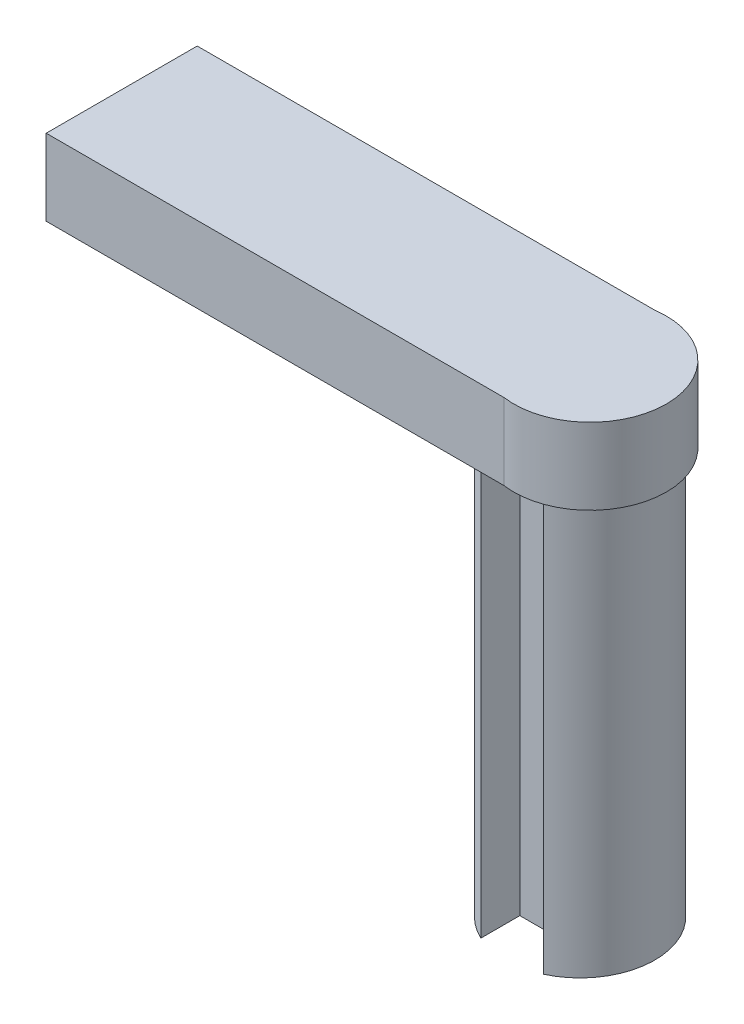
ISO-10303-21;
HEADER;
FILE_DESCRIPTION(('STEP AP214'),'2;1');
FILE_NAME('part.step','',(''),(''),'','','');
FILE_SCHEMA(('AUTOMOTIVE_DESIGN { 1 0 10303 214 1 1 1 1 }'));
ENDSEC;
DATA;
#1=APPLICATION_CONTEXT('core data for automotive mechanical design processes');
#2=APPLICATION_PROTOCOL_DEFINITION('international standard','automotive_design',2000,#1);
#3=PRODUCT_CONTEXT('',#1,'mechanical');
#4=PRODUCT('Part','Part','',(#3));
#5=PRODUCT_RELATED_PRODUCT_CATEGORY('part','',(#4));
#6=PRODUCT_DEFINITION_FORMATION('','',#4);
#7=PRODUCT_DEFINITION_CONTEXT('part definition',#1,'design');
#8=PRODUCT_DEFINITION('design','',#6,#7);
#9=PRODUCT_DEFINITION_SHAPE('','',#8);
#10=(LENGTH_UNIT() NAMED_UNIT(*) SI_UNIT(.MILLI.,.METRE.));
#11=(NAMED_UNIT(*) PLANE_ANGLE_UNIT() SI_UNIT($,.RADIAN.));
#12=(NAMED_UNIT(*) SI_UNIT($,.STERADIAN.) SOLID_ANGLE_UNIT());
#13=UNCERTAINTY_MEASURE_WITH_UNIT(LENGTH_MEASURE(1.E-05),#10,'distance_accuracy_value','');
#14=(GEOMETRIC_REPRESENTATION_CONTEXT(3) GLOBAL_UNCERTAINTY_ASSIGNED_CONTEXT((#13)) GLOBAL_UNIT_ASSIGNED_CONTEXT((#10,
#11,#12)) REPRESENTATION_CONTEXT('',''));
#15=CARTESIAN_POINT('',(0.,0.,0.));
#16=DIRECTION('',(0.,0.,1.));
#17=DIRECTION('',(1.,0.,0.));
#18=AXIS2_PLACEMENT_3D('',#15,#16,#17);
#19=CARTESIAN_POINT('',(0.,27.,0.));
#20=DIRECTION('',(0.,-1.,0.));
#21=DIRECTION('',(0.,0.,-1.));
#22=AXIS2_PLACEMENT_3D('',#19,#20,#21);
#23=CYLINDRICAL_SURFACE('',#22,4.9);
#24=CARTESIAN_POINT('',(0.,0.,0.));
#25=DIRECTION('',(0.,1.,0.));
#26=DIRECTION('',(0.,0.,1.));
#27=AXIS2_PLACEMENT_3D('',#24,#25,#26);
#28=CIRCLE('',#27,4.9);
#29=CARTESIAN_POINT('',(2.05,0.,4.45056176229474));
#30=VERTEX_POINT('',#29);
#31=CARTESIAN_POINT('',(-2.05,0.,4.45056176229473));
#32=VERTEX_POINT('',#31);
#33=EDGE_CURVE('E139',#30,#32,#28,.T.);
#34=ORIENTED_EDGE('',*,*,#33,.T.);
#35=DIRECTION('',(0.,1.,0.));
#36=VECTOR('',#35,1.);
#37=CARTESIAN_POINT('',(-2.05,-1.,4.45056176229473));
#38=LINE('',#37,#36);
#39=CARTESIAN_POINT('',(-2.05,27.,4.45056176229473));
#40=VERTEX_POINT('',#39);
#41=EDGE_CURVE('E137',#32,#40,#38,.T.);
#42=ORIENTED_EDGE('',*,*,#41,.T.);
#43=CARTESIAN_POINT('',(0.,27.,0.));
#44=DIRECTION('',(0.,1.,0.));
#45=DIRECTION('',(0.,0.,1.));
#46=AXIS2_PLACEMENT_3D('',#43,#44,#45);
#47=CIRCLE('',#46,4.9);
#48=CARTESIAN_POINT('',(0.,27.,-4.9));
#49=VERTEX_POINT('',#48);
#50=EDGE_CURVE('E47',#49,#40,#47,.T.);
#51=ORIENTED_EDGE('',*,*,#50,.F.);
#52=CARTESIAN_POINT('',(2.05,27.,4.45056176229474));
#53=VERTEX_POINT('',#52);
#54=EDGE_CURVE('E144',#53,#49,#47,.T.);
#55=ORIENTED_EDGE('',*,*,#54,.F.);
#56=DIRECTION('',(0.,1.,0.));
#57=VECTOR('',#56,1.);
#58=CARTESIAN_POINT('',(2.05,-1.,4.45056176229474));
#59=LINE('',#58,#57);
#60=EDGE_CURVE('E136',#30,#53,#59,.T.);
#61=ORIENTED_EDGE('',*,*,#60,.F.);
#62=EDGE_LOOP('',(#34,#42,#51,#55,#61));
#63=FACE_BOUND('',#62,.T.);
#64=ADVANCED_FACE('F33',(#63),#23,.T.);
#65=CARTESIAN_POINT('',(0.,0.,0.));
#66=DIRECTION('',(0.,1.,0.));
#67=DIRECTION('',(0.,0.,1.));
#68=AXIS2_PLACEMENT_3D('',#65,#66,#67);
#69=PLANE('',#68);
#70=DIRECTION('',(-1.,0.,0.));
#71=VECTOR('',#70,1.);
#72=CARTESIAN_POINT('',(0.,0.,1.90056176229474));
#73=LINE('',#72,#71);
#74=CARTESIAN_POINT('',(2.05,0.,1.90056176229474));
#75=VERTEX_POINT('',#74);
#76=CARTESIAN_POINT('',(-2.05,0.,1.90056176229474));
#77=VERTEX_POINT('',#76);
#78=EDGE_CURVE('E40',#75,#77,#73,.T.);
#79=ORIENTED_EDGE('',*,*,#78,.T.);
#80=DIRECTION('',(0.,0.,1.));
#81=VECTOR('',#80,1.);
#82=CARTESIAN_POINT('',(-2.05,0.,0.));
#83=LINE('',#82,#81);
#84=EDGE_CURVE('E11',#77,#32,#83,.T.);
#85=ORIENTED_EDGE('',*,*,#84,.T.);
#86=ORIENTED_EDGE('',*,*,#33,.F.);
#87=DIRECTION('',(0.,0.,-1.));
#88=VECTOR('',#87,1.);
#89=CARTESIAN_POINT('',(2.05,0.,0.));
#90=LINE('',#89,#88);
#91=EDGE_CURVE('E146',#30,#75,#90,.T.);
#92=ORIENTED_EDGE('',*,*,#91,.T.);
#93=EDGE_LOOP('',(#79,#85,#86,#92));
#94=FACE_BOUND('',#93,.T.);
#95=ADVANCED_FACE('F152',(#94),#69,.F.);
#96=CARTESIAN_POINT('',(-2.05,-1.,4.45056176229473));
#97=DIRECTION('',(-1.,0.,0.));
#98=DIRECTION('',(0.,0.,1.));
#99=AXIS2_PLACEMENT_3D('',#96,#97,#98);
#100=PLANE('',#99);
#101=DIRECTION('',(0.,1.,0.));
#102=VECTOR('',#101,1.);
#103=CARTESIAN_POINT('',(-2.05,-1.,1.90056176229474));
#104=LINE('',#103,#102);
#105=CARTESIAN_POINT('',(-2.05,27.,1.90056176229474));
#106=VERTEX_POINT('',#105);
#107=EDGE_CURVE('E140',#77,#106,#104,.T.);
#108=ORIENTED_EDGE('',*,*,#107,.T.);
#109=DIRECTION('',(0.,0.,1.));
#110=VECTOR('',#109,1.);
#111=CARTESIAN_POINT('',(-2.05,27.,4.45056176229473));
#112=LINE('',#111,#110);
#113=EDGE_CURVE('E133',#106,#40,#112,.T.);
#114=ORIENTED_EDGE('',*,*,#113,.T.);
#115=ORIENTED_EDGE('',*,*,#41,.F.);
#116=ORIENTED_EDGE('',*,*,#84,.F.);
#117=EDGE_LOOP('',(#108,#114,#115,#116));
#118=FACE_BOUND('',#117,.T.);
#119=ADVANCED_FACE('F160',(#118),#100,.F.);
#120=CARTESIAN_POINT('',(-2.05,-1.,1.90056176229474));
#121=DIRECTION('',(0.,0.,-1.));
#122=DIRECTION('',(-1.,0.,0.));
#123=AXIS2_PLACEMENT_3D('',#120,#121,#122);
#124=PLANE('',#123);
#125=DIRECTION('',(0.,1.,0.));
#126=VECTOR('',#125,1.);
#127=CARTESIAN_POINT('',(2.05,-1.,1.90056176229474));
#128=LINE('',#127,#126);
#129=CARTESIAN_POINT('',(2.05,27.,1.90056176229474));
#130=VERTEX_POINT('',#129);
#131=EDGE_CURVE('E55',#75,#130,#128,.T.);
#132=ORIENTED_EDGE('',*,*,#131,.T.);
#133=DIRECTION('',(-1.,0.,0.));
#134=VECTOR('',#133,1.);
#135=CARTESIAN_POINT('',(-2.05,27.,1.90056176229474));
#136=LINE('',#135,#134);
#137=EDGE_CURVE('E125',#130,#106,#136,.T.);
#138=ORIENTED_EDGE('',*,*,#137,.T.);
#139=ORIENTED_EDGE('',*,*,#107,.F.);
#140=ORIENTED_EDGE('',*,*,#78,.F.);
#141=EDGE_LOOP('',(#132,#138,#139,#140));
#142=FACE_BOUND('',#141,.T.);
#143=ADVANCED_FACE('F156',(#142),#124,.F.);
#144=CARTESIAN_POINT('',(2.05,-1.,1.90056176229474));
#145=DIRECTION('',(1.,0.,0.));
#146=DIRECTION('',(0.,0.,-1.));
#147=AXIS2_PLACEMENT_3D('',#144,#145,#146);
#148=PLANE('',#147);
#149=ORIENTED_EDGE('',*,*,#60,.T.);
#150=DIRECTION('',(0.,0.,-1.));
#151=VECTOR('',#150,1.);
#152=CARTESIAN_POINT('',(2.05,27.,1.90056176229474));
#153=LINE('',#152,#151);
#154=EDGE_CURVE('E123',#53,#130,#153,.T.);
#155=ORIENTED_EDGE('',*,*,#154,.T.);
#156=ORIENTED_EDGE('',*,*,#131,.F.);
#157=ORIENTED_EDGE('',*,*,#91,.F.);
#158=EDGE_LOOP('',(#149,#155,#156,#157));
#159=FACE_BOUND('',#158,.T.);
#160=ADVANCED_FACE('F163',(#159),#148,.F.);
#161=CARTESIAN_POINT('',(0.705336798983298,32.,0.0499999999999984));
#162=DIRECTION('',(0.,-1.,0.));
#163=DIRECTION('',(0.,0.,-1.));
#164=AXIS2_PLACEMENT_3D('',#161,#162,#163);
#165=CYLINDRICAL_SURFACE('',#164,5.);
#166=CARTESIAN_POINT('',(0.705336798983298,27.,0.0499999999999984));
#167=DIRECTION('',(0.,1.,0.));
#168=DIRECTION('',(0.,0.,1.));
#169=AXIS2_PLACEMENT_3D('',#166,#167,#168);
#170=CIRCLE('',#169,5.);
#171=CARTESIAN_POINT('',(0.,27.,5.));
#172=VERTEX_POINT('',#171);
#173=EDGE_CURVE('E122',#172,#49,#170,.T.);
#174=ORIENTED_EDGE('',*,*,#173,.T.);
#175=DIRECTION('',(0.,-1.,0.));
#176=VECTOR('',#175,1.);
#177=CARTESIAN_POINT('',(0.,32.,-4.9));
#178=LINE('',#177,#176);
#179=CARTESIAN_POINT('',(0.,32.,-4.9));
#180=VERTEX_POINT('',#179);
#181=EDGE_CURVE('E102',#180,#49,#178,.T.);
#182=ORIENTED_EDGE('',*,*,#181,.F.);
#183=CARTESIAN_POINT('',(0.705336798983298,32.,0.0499999999999984));
#184=DIRECTION('',(0.,1.,0.));
#185=DIRECTION('',(0.,0.,1.));
#186=AXIS2_PLACEMENT_3D('',#183,#184,#185);
#187=CIRCLE('',#186,5.);
#188=CARTESIAN_POINT('',(0.,32.,5.));
#189=VERTEX_POINT('',#188);
#190=EDGE_CURVE('E109',#189,#180,#187,.T.);
#191=ORIENTED_EDGE('',*,*,#190,.F.);
#192=DIRECTION('',(0.,-1.,0.));
#193=VECTOR('',#192,1.);
#194=CARTESIAN_POINT('',(0.,32.,5.));
#195=LINE('',#194,#193);
#196=EDGE_CURVE('E177',#189,#172,#195,.T.);
#197=ORIENTED_EDGE('',*,*,#196,.T.);
#198=EDGE_LOOP('',(#174,#182,#191,#197));
#199=FACE_BOUND('',#198,.T.);
#200=ADVANCED_FACE('F120',(#199),#165,.T.);
#201=CARTESIAN_POINT('',(0.,32.,-4.9));
#202=DIRECTION('',(0.,0.,1.));
#203=DIRECTION('',(1.,0.,0.));
#204=AXIS2_PLACEMENT_3D('',#201,#202,#203);
#205=PLANE('',#204);
#206=DIRECTION('',(-1.,0.,0.));
#207=VECTOR('',#206,1.);
#208=CARTESIAN_POINT('',(0.,27.,-4.9));
#209=LINE('',#208,#207);
#210=CARTESIAN_POINT('',(-30.,27.,-4.9));
#211=VERTEX_POINT('',#210);
#212=EDGE_CURVE('E168',#49,#211,#209,.T.);
#213=ORIENTED_EDGE('',*,*,#212,.T.);
#214=DIRECTION('',(0.,-1.,0.));
#215=VECTOR('',#214,1.);
#216=CARTESIAN_POINT('',(-30.,32.,-4.9));
#217=LINE('',#216,#215);
#218=CARTESIAN_POINT('',(-30.,32.,-4.9));
#219=VERTEX_POINT('',#218);
#220=EDGE_CURVE('E105',#219,#211,#217,.T.);
#221=ORIENTED_EDGE('',*,*,#220,.F.);
#222=DIRECTION('',(-1.,0.,0.));
#223=VECTOR('',#222,1.);
#224=CARTESIAN_POINT('',(0.,32.,-4.9));
#225=LINE('',#224,#223);
#226=EDGE_CURVE('E98',#180,#219,#225,.T.);
#227=ORIENTED_EDGE('',*,*,#226,.F.);
#228=ORIENTED_EDGE('',*,*,#181,.T.);
#229=EDGE_LOOP('',(#213,#221,#227,#228));
#230=FACE_BOUND('',#229,.T.);
#231=ADVANCED_FACE('F100',(#230),#205,.F.);
#232=CARTESIAN_POINT('',(-30.,32.,-4.9));
#233=DIRECTION('',(1.,0.,0.));
#234=DIRECTION('',(0.,0.,-1.));
#235=AXIS2_PLACEMENT_3D('',#232,#233,#234);
#236=PLANE('',#235);
#237=DIRECTION('',(0.,0.,1.));
#238=VECTOR('',#237,1.);
#239=CARTESIAN_POINT('',(-30.,27.,-4.9));
#240=LINE('',#239,#238);
#241=CARTESIAN_POINT('',(-30.,27.,5.));
#242=VERTEX_POINT('',#241);
#243=EDGE_CURVE('E170',#211,#242,#240,.T.);
#244=ORIENTED_EDGE('',*,*,#243,.T.);
#245=DIRECTION('',(0.,-1.,0.));
#246=VECTOR('',#245,1.);
#247=CARTESIAN_POINT('',(-30.,32.,5.));
#248=LINE('',#247,#246);
#249=CARTESIAN_POINT('',(-30.,32.,5.));
#250=VERTEX_POINT('',#249);
#251=EDGE_CURVE('E127',#250,#242,#248,.T.);
#252=ORIENTED_EDGE('',*,*,#251,.F.);
#253=DIRECTION('',(0.,0.,1.));
#254=VECTOR('',#253,1.);
#255=CARTESIAN_POINT('',(-30.,32.,-4.9));
#256=LINE('',#255,#254);
#257=EDGE_CURVE('E108',#219,#250,#256,.T.);
#258=ORIENTED_EDGE('',*,*,#257,.F.);
#259=ORIENTED_EDGE('',*,*,#220,.T.);
#260=EDGE_LOOP('',(#244,#252,#258,#259));
#261=FACE_BOUND('',#260,.T.);
#262=ADVANCED_FACE('F183',(#261),#236,.F.);
#263=CARTESIAN_POINT('',(0.,32.,5.));
#264=DIRECTION('',(0.,0.,-1.));
#265=DIRECTION('',(-1.,0.,0.));
#266=AXIS2_PLACEMENT_3D('',#263,#264,#265);
#267=PLANE('',#266);
#268=DIRECTION('',(1.,0.,0.));
#269=VECTOR('',#268,1.);
#270=CARTESIAN_POINT('',(0.,27.,5.));
#271=LINE('',#270,#269);
#272=EDGE_CURVE('E118',#242,#172,#271,.T.);
#273=ORIENTED_EDGE('',*,*,#272,.T.);
#274=ORIENTED_EDGE('',*,*,#196,.F.);
#275=DIRECTION('',(1.,0.,0.));
#276=VECTOR('',#275,1.);
#277=CARTESIAN_POINT('',(0.,32.,5.));
#278=LINE('',#277,#276);
#279=EDGE_CURVE('E114',#250,#189,#278,.T.);
#280=ORIENTED_EDGE('',*,*,#279,.F.);
#281=ORIENTED_EDGE('',*,*,#251,.T.);
#282=EDGE_LOOP('',(#273,#274,#280,#281));
#283=FACE_BOUND('',#282,.T.);
#284=ADVANCED_FACE('F181',(#283),#267,.F.);
#285=CARTESIAN_POINT('',(0.705336798983298,32.,0.0499999999999984));
#286=DIRECTION('',(0.,1.,0.));
#287=DIRECTION('',(0.,0.,1.));
#288=AXIS2_PLACEMENT_3D('',#285,#286,#287);
#289=PLANE('',#288);
#290=ORIENTED_EDGE('',*,*,#190,.T.);
#291=ORIENTED_EDGE('',*,*,#226,.T.);
#292=ORIENTED_EDGE('',*,*,#257,.T.);
#293=ORIENTED_EDGE('',*,*,#279,.T.);
#294=EDGE_LOOP('',(#290,#291,#292,#293));
#295=FACE_BOUND('',#294,.T.);
#296=ADVANCED_FACE('F112',(#295),#289,.T.);
#297=CARTESIAN_POINT('',(0.705336798983298,27.,0.0499999999999984));
#298=DIRECTION('',(0.,1.,0.));
#299=DIRECTION('',(0.,0.,1.));
#300=AXIS2_PLACEMENT_3D('',#297,#298,#299);
#301=PLANE('',#300);
#302=ORIENTED_EDGE('',*,*,#113,.F.);
#303=ORIENTED_EDGE('',*,*,#137,.F.);
#304=ORIENTED_EDGE('',*,*,#154,.F.);
#305=ORIENTED_EDGE('',*,*,#54,.T.);
#306=ORIENTED_EDGE('',*,*,#173,.F.);
#307=ORIENTED_EDGE('',*,*,#272,.F.);
#308=ORIENTED_EDGE('',*,*,#243,.F.);
#309=ORIENTED_EDGE('',*,*,#212,.F.);
#310=ORIENTED_EDGE('',*,*,#50,.T.);
#311=EDGE_LOOP('',(#302,#303,#304,#305,#306,#307,#308,#309,#310));
#312=FACE_BOUND('',#311,.T.);
#313=ADVANCED_FACE('F165',(#312),#301,.F.);
#314=CLOSED_SHELL('',(#64,#95,#119,#143,#160,#200,#231,#262,#284,#296,#313));
#315=MANIFOLD_SOLID_BREP('B2',#314);
#316=ADVANCED_BREP_SHAPE_REPRESENTATION('',(#18,#315),#14);
#317=SHAPE_DEFINITION_REPRESENTATION(#9,#316);
ENDSEC;
END-ISO-10303-21;
